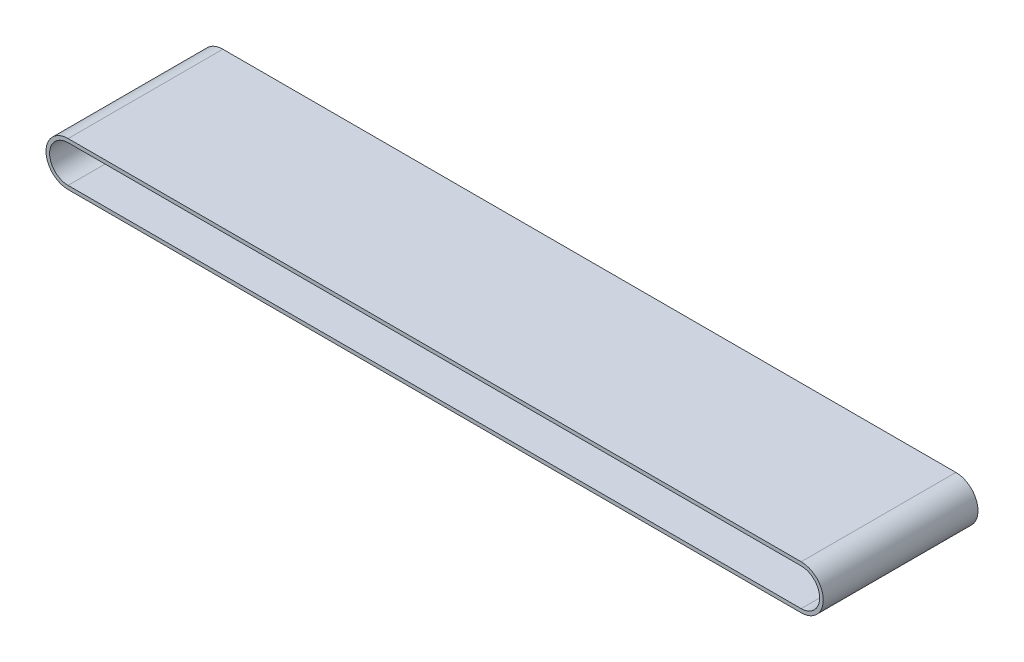
ISO-10303-21;
HEADER;
FILE_DESCRIPTION(('STEP AP214'),'2;1');
FILE_NAME('part.step','',(''),(''),'','','');
FILE_SCHEMA(('AUTOMOTIVE_DESIGN { 1 0 10303 214 1 1 1 1 }'));
ENDSEC;
DATA;
#1=APPLICATION_CONTEXT('core data for automotive mechanical design processes');
#2=APPLICATION_PROTOCOL_DEFINITION('international standard','automotive_design',2000,#1);
#3=PRODUCT_CONTEXT('',#1,'mechanical');
#4=PRODUCT('Part','Part','',(#3));
#5=PRODUCT_RELATED_PRODUCT_CATEGORY('part','',(#4));
#6=PRODUCT_DEFINITION_FORMATION('','',#4);
#7=PRODUCT_DEFINITION_CONTEXT('part definition',#1,'design');
#8=PRODUCT_DEFINITION('design','',#6,#7);
#9=PRODUCT_DEFINITION_SHAPE('','',#8);
#10=(LENGTH_UNIT() NAMED_UNIT(*) SI_UNIT(.MILLI.,.METRE.));
#11=(NAMED_UNIT(*) PLANE_ANGLE_UNIT() SI_UNIT($,.RADIAN.));
#12=(NAMED_UNIT(*) SI_UNIT($,.STERADIAN.) SOLID_ANGLE_UNIT());
#13=UNCERTAINTY_MEASURE_WITH_UNIT(LENGTH_MEASURE(1.E-05),#10,'distance_accuracy_value','');
#14=(GEOMETRIC_REPRESENTATION_CONTEXT(3) GLOBAL_UNCERTAINTY_ASSIGNED_CONTEXT((#13)) GLOBAL_UNIT_ASSIGNED_CONTEXT((#10,
#11,#12)) REPRESENTATION_CONTEXT('',''));
#15=CARTESIAN_POINT('',(0.,0.,0.));
#16=DIRECTION('',(0.,0.,1.));
#17=DIRECTION('',(1.,0.,0.));
#18=AXIS2_PLACEMENT_3D('',#15,#16,#17);
#19=CARTESIAN_POINT('',(-2517.43024211006,-127.5,1067.));
#20=DIRECTION('',(0.,0.,1.));
#21=DIRECTION('',(1.,0.,0.));
#22=AXIS2_PLACEMENT_3D('',#19,#20,#21);
#23=PLANE('',#22);
#24=CARTESIAN_POINT('',(-2517.43024211006,-127.5,1067.));
#25=DIRECTION('',(0.,0.,1.));
#26=DIRECTION('',(1.,0.,0.));
#27=AXIS2_PLACEMENT_3D('',#24,#25,#26);
#28=CIRCLE('',#27,152.5);
#29=CARTESIAN_POINT('',(-2517.43024211006,25.,1067.));
#30=VERTEX_POINT('',#29);
#31=CARTESIAN_POINT('',(-2517.43024211006,-280.,1067.));
#32=VERTEX_POINT('',#31);
#33=EDGE_CURVE('E155',#30,#32,#28,.T.);
#34=ORIENTED_EDGE('',*,*,#33,.T.);
#35=DIRECTION('',(1.,0.,0.));
#36=VECTOR('',#35,1.);
#37=CARTESIAN_POINT('',(-2517.43024211006,-280.,1067.));
#38=LINE('',#37,#36);
#39=CARTESIAN_POINT('',(2537.56975788994,-280.,1067.));
#40=VERTEX_POINT('',#39);
#41=EDGE_CURVE('E159',#32,#40,#38,.T.);
#42=ORIENTED_EDGE('',*,*,#41,.T.);
#43=CARTESIAN_POINT('',(2537.56975788994,-127.5,1067.));
#44=DIRECTION('',(0.,0.,1.));
#45=DIRECTION('',(-1.,0.,0.));
#46=AXIS2_PLACEMENT_3D('',#43,#44,#45);
#47=CIRCLE('',#46,152.5);
#48=CARTESIAN_POINT('',(2537.56975788994,25.,1067.));
#49=VERTEX_POINT('',#48);
#50=EDGE_CURVE('E163',#40,#49,#47,.T.);
#51=ORIENTED_EDGE('',*,*,#50,.T.);
#52=DIRECTION('',(-1.,0.,0.));
#53=VECTOR('',#52,1.);
#54=CARTESIAN_POINT('',(-2517.43024211006,25.,1067.));
#55=LINE('',#54,#53);
#56=EDGE_CURVE('E166',#49,#30,#55,.T.);
#57=ORIENTED_EDGE('',*,*,#56,.T.);
#58=EDGE_LOOP('',(#34,#42,#51,#57));
#59=FACE_BOUND('',#58,.T.);
#60=DIRECTION('',(1.,0.,0.));
#61=VECTOR('',#60,1.);
#62=CARTESIAN_POINT('',(-2517.43024211006,-255.,1067.));
#63=LINE('',#62,#61);
#64=CARTESIAN_POINT('',(-2517.43024211006,-255.,1067.));
#65=VERTEX_POINT('',#64);
#66=CARTESIAN_POINT('',(2537.56975788994,-255.,1067.));
#67=VERTEX_POINT('',#66);
#68=EDGE_CURVE('E116',#65,#67,#63,.T.);
#69=ORIENTED_EDGE('',*,*,#68,.F.);
#70=CARTESIAN_POINT('',(-2517.43024211006,-127.5,1067.));
#71=DIRECTION('',(0.,0.,1.));
#72=DIRECTION('',(1.,0.,0.));
#73=AXIS2_PLACEMENT_3D('',#70,#71,#72);
#74=CIRCLE('',#73,127.5);
#75=CARTESIAN_POINT('',(-2517.43024211006,0.,1067.));
#76=VERTEX_POINT('',#75);
#77=EDGE_CURVE('E107',#76,#65,#74,.T.);
#78=ORIENTED_EDGE('',*,*,#77,.F.);
#79=DIRECTION('',(-1.,0.,0.));
#80=VECTOR('',#79,1.);
#81=CARTESIAN_POINT('',(-2517.43024211006,0.,1067.));
#82=LINE('',#81,#80);
#83=CARTESIAN_POINT('',(2537.56975788994,0.,1067.));
#84=VERTEX_POINT('',#83);
#85=EDGE_CURVE('E133',#84,#76,#82,.T.);
#86=ORIENTED_EDGE('',*,*,#85,.F.);
#87=CARTESIAN_POINT('',(2537.56975788994,-127.5,1067.));
#88=DIRECTION('',(0.,0.,1.));
#89=DIRECTION('',(-1.,0.,0.));
#90=AXIS2_PLACEMENT_3D('',#87,#88,#89);
#91=CIRCLE('',#90,127.5);
#92=EDGE_CURVE('E129',#67,#84,#91,.T.);
#93=ORIENTED_EDGE('',*,*,#92,.F.);
#94=EDGE_LOOP('',(#69,#78,#86,#93));
#95=FACE_BOUND('',#94,.T.);
#96=ADVANCED_FACE('F41',(#59,#95),#23,.T.);
#97=CARTESIAN_POINT('',(-2517.43024211006,-127.5,0.));
#98=DIRECTION('',(0.,0.,1.));
#99=DIRECTION('',(1.,0.,0.));
#100=AXIS2_PLACEMENT_3D('',#97,#98,#99);
#101=PLANE('',#100);
#102=CARTESIAN_POINT('',(-2517.43024211006,-127.5,0.));
#103=DIRECTION('',(0.,0.,1.));
#104=DIRECTION('',(1.,0.,0.));
#105=AXIS2_PLACEMENT_3D('',#102,#103,#104);
#106=CIRCLE('',#105,152.5);
#107=CARTESIAN_POINT('',(-2517.43024211006,25.,0.));
#108=VERTEX_POINT('',#107);
#109=CARTESIAN_POINT('',(-2517.43024211006,-280.,0.));
#110=VERTEX_POINT('',#109);
#111=EDGE_CURVE('E125',#108,#110,#106,.T.);
#112=ORIENTED_EDGE('',*,*,#111,.F.);
#113=DIRECTION('',(-1.,0.,0.));
#114=VECTOR('',#113,1.);
#115=CARTESIAN_POINT('',(-2517.43024211006,25.,0.));
#116=LINE('',#115,#114);
#117=CARTESIAN_POINT('',(2537.56975788994,25.,0.));
#118=VERTEX_POINT('',#117);
#119=EDGE_CURVE('E160',#118,#108,#116,.T.);
#120=ORIENTED_EDGE('',*,*,#119,.F.);
#121=CARTESIAN_POINT('',(2537.56975788994,-127.5,0.));
#122=DIRECTION('',(0.,0.,1.));
#123=DIRECTION('',(-1.,0.,0.));
#124=AXIS2_PLACEMENT_3D('',#121,#122,#123);
#125=CIRCLE('',#124,152.5);
#126=CARTESIAN_POINT('',(2537.56975788994,-280.,0.));
#127=VERTEX_POINT('',#126);
#128=EDGE_CURVE('E176',#127,#118,#125,.T.);
#129=ORIENTED_EDGE('',*,*,#128,.F.);
#130=DIRECTION('',(1.,0.,0.));
#131=VECTOR('',#130,1.);
#132=CARTESIAN_POINT('',(-2517.43024211006,-280.,0.));
#133=LINE('',#132,#131);
#134=EDGE_CURVE('E173',#110,#127,#133,.T.);
#135=ORIENTED_EDGE('',*,*,#134,.F.);
#136=EDGE_LOOP('',(#112,#120,#129,#135));
#137=FACE_BOUND('',#136,.T.);
#138=CARTESIAN_POINT('',(-2517.43024211006,-127.5,0.));
#139=DIRECTION('',(0.,0.,1.));
#140=DIRECTION('',(1.,0.,0.));
#141=AXIS2_PLACEMENT_3D('',#138,#139,#140);
#142=CIRCLE('',#141,127.5);
#143=CARTESIAN_POINT('',(-2517.43024211006,0.,0.));
#144=VERTEX_POINT('',#143);
#145=CARTESIAN_POINT('',(-2517.43024211006,-255.,0.));
#146=VERTEX_POINT('',#145);
#147=EDGE_CURVE('E65',#144,#146,#142,.T.);
#148=ORIENTED_EDGE('',*,*,#147,.T.);
#149=DIRECTION('',(1.,0.,0.));
#150=VECTOR('',#149,1.);
#151=CARTESIAN_POINT('',(-2517.43024211006,-255.,0.));
#152=LINE('',#151,#150);
#153=CARTESIAN_POINT('',(2537.56975788994,-255.,0.));
#154=VERTEX_POINT('',#153);
#155=EDGE_CURVE('E123',#146,#154,#152,.T.);
#156=ORIENTED_EDGE('',*,*,#155,.T.);
#157=CARTESIAN_POINT('',(2537.56975788994,-127.5,0.));
#158=DIRECTION('',(0.,0.,1.));
#159=DIRECTION('',(-1.,0.,0.));
#160=AXIS2_PLACEMENT_3D('',#157,#158,#159);
#161=CIRCLE('',#160,127.5);
#162=CARTESIAN_POINT('',(2537.56975788994,0.,0.));
#163=VERTEX_POINT('',#162);
#164=EDGE_CURVE('E142',#154,#163,#161,.T.);
#165=ORIENTED_EDGE('',*,*,#164,.T.);
#166=DIRECTION('',(-1.,0.,0.));
#167=VECTOR('',#166,1.);
#168=CARTESIAN_POINT('',(-2517.43024211006,0.,0.));
#169=LINE('',#168,#167);
#170=EDGE_CURVE('E117',#163,#144,#169,.T.);
#171=ORIENTED_EDGE('',*,*,#170,.T.);
#172=EDGE_LOOP('',(#148,#156,#165,#171));
#173=FACE_BOUND('',#172,.T.);
#174=ADVANCED_FACE('F199',(#137,#173),#101,.F.);
#175=CARTESIAN_POINT('',(-2517.43024211006,-127.5,1067.));
#176=DIRECTION('',(0.,0.,-1.));
#177=DIRECTION('',(-1.,0.,0.));
#178=AXIS2_PLACEMENT_3D('',#175,#176,#177);
#179=CYLINDRICAL_SURFACE('',#178,152.5);
#180=ORIENTED_EDGE('',*,*,#111,.T.);
#181=DIRECTION('',(0.,0.,-1.));
#182=VECTOR('',#181,1.);
#183=CARTESIAN_POINT('',(-2517.43024211006,-280.,1067.));
#184=LINE('',#183,#182);
#185=EDGE_CURVE('E11',#32,#110,#184,.T.);
#186=ORIENTED_EDGE('',*,*,#185,.F.);
#187=ORIENTED_EDGE('',*,*,#33,.F.);
#188=DIRECTION('',(0.,0.,-1.));
#189=VECTOR('',#188,1.);
#190=CARTESIAN_POINT('',(-2517.43024211006,25.,1067.));
#191=LINE('',#190,#189);
#192=EDGE_CURVE('E169',#30,#108,#191,.T.);
#193=ORIENTED_EDGE('',*,*,#192,.T.);
#194=EDGE_LOOP('',(#180,#186,#187,#193));
#195=FACE_BOUND('',#194,.T.);
#196=ADVANCED_FACE('F43',(#195),#179,.T.);
#197=CARTESIAN_POINT('',(-2517.43024211006,-280.,1067.));
#198=DIRECTION('',(0.,1.,0.));
#199=DIRECTION('',(0.,0.,1.));
#200=AXIS2_PLACEMENT_3D('',#197,#198,#199);
#201=PLANE('',#200);
#202=ORIENTED_EDGE('',*,*,#134,.T.);
#203=DIRECTION('',(0.,0.,-1.));
#204=VECTOR('',#203,1.);
#205=CARTESIAN_POINT('',(2537.56975788994,-280.,1067.));
#206=LINE('',#205,#204);
#207=EDGE_CURVE('E50',#40,#127,#206,.T.);
#208=ORIENTED_EDGE('',*,*,#207,.F.);
#209=ORIENTED_EDGE('',*,*,#41,.F.);
#210=ORIENTED_EDGE('',*,*,#185,.T.);
#211=EDGE_LOOP('',(#202,#208,#209,#210));
#212=FACE_BOUND('',#211,.T.);
#213=ADVANCED_FACE('F209',(#212),#201,.F.);
#214=CARTESIAN_POINT('',(2537.56975788994,-127.5,1067.));
#215=DIRECTION('',(0.,0.,-1.));
#216=DIRECTION('',(-1.,0.,0.));
#217=AXIS2_PLACEMENT_3D('',#214,#215,#216);
#218=CYLINDRICAL_SURFACE('',#217,152.5);
#219=ORIENTED_EDGE('',*,*,#128,.T.);
#220=DIRECTION('',(0.,0.,-1.));
#221=VECTOR('',#220,1.);
#222=CARTESIAN_POINT('',(2537.56975788994,25.,1067.));
#223=LINE('',#222,#221);
#224=EDGE_CURVE('E184',#49,#118,#223,.T.);
#225=ORIENTED_EDGE('',*,*,#224,.F.);
#226=ORIENTED_EDGE('',*,*,#50,.F.);
#227=ORIENTED_EDGE('',*,*,#207,.T.);
#228=EDGE_LOOP('',(#219,#225,#226,#227));
#229=FACE_BOUND('',#228,.T.);
#230=ADVANCED_FACE('F193',(#229),#218,.T.);
#231=CARTESIAN_POINT('',(-2517.43024211006,25.,1067.));
#232=DIRECTION('',(0.,-1.,0.));
#233=DIRECTION('',(0.,0.,-1.));
#234=AXIS2_PLACEMENT_3D('',#231,#232,#233);
#235=PLANE('',#234);
#236=ORIENTED_EDGE('',*,*,#119,.T.);
#237=ORIENTED_EDGE('',*,*,#192,.F.);
#238=ORIENTED_EDGE('',*,*,#56,.F.);
#239=ORIENTED_EDGE('',*,*,#224,.T.);
#240=EDGE_LOOP('',(#236,#237,#238,#239));
#241=FACE_BOUND('',#240,.T.);
#242=ADVANCED_FACE('F203',(#241),#235,.F.);
#243=CARTESIAN_POINT('',(-2517.43024211006,-127.5,1067.));
#244=DIRECTION('',(0.,0.,-1.));
#245=DIRECTION('',(-1.,0.,0.));
#246=AXIS2_PLACEMENT_3D('',#243,#244,#245);
#247=CYLINDRICAL_SURFACE('',#246,127.5);
#248=ORIENTED_EDGE('',*,*,#147,.F.);
#249=DIRECTION('',(0.,0.,-1.));
#250=VECTOR('',#249,1.);
#251=CARTESIAN_POINT('',(-2517.43024211006,0.,1067.));
#252=LINE('',#251,#250);
#253=EDGE_CURVE('E111',#76,#144,#252,.T.);
#254=ORIENTED_EDGE('',*,*,#253,.F.);
#255=ORIENTED_EDGE('',*,*,#77,.T.);
#256=DIRECTION('',(0.,0.,-1.));
#257=VECTOR('',#256,1.);
#258=CARTESIAN_POINT('',(-2517.43024211006,-255.,1067.));
#259=LINE('',#258,#257);
#260=EDGE_CURVE('E110',#65,#146,#259,.T.);
#261=ORIENTED_EDGE('',*,*,#260,.T.);
#262=EDGE_LOOP('',(#248,#254,#255,#261));
#263=FACE_BOUND('',#262,.T.);
#264=ADVANCED_FACE('F109',(#263),#247,.F.);
#265=CARTESIAN_POINT('',(-2517.43024211006,-255.,1067.));
#266=DIRECTION('',(0.,1.,0.));
#267=DIRECTION('',(-1.,0.,0.));
#268=AXIS2_PLACEMENT_3D('',#265,#266,#267);
#269=PLANE('',#268);
#270=ORIENTED_EDGE('',*,*,#155,.F.);
#271=ORIENTED_EDGE('',*,*,#260,.F.);
#272=ORIENTED_EDGE('',*,*,#68,.T.);
#273=DIRECTION('',(0.,0.,-1.));
#274=VECTOR('',#273,1.);
#275=CARTESIAN_POINT('',(2537.56975788994,-255.,1067.));
#276=LINE('',#275,#274);
#277=EDGE_CURVE('E126',#67,#154,#276,.T.);
#278=ORIENTED_EDGE('',*,*,#277,.T.);
#279=EDGE_LOOP('',(#270,#271,#272,#278));
#280=FACE_BOUND('',#279,.T.);
#281=ADVANCED_FACE('F120',(#280),#269,.T.);
#282=CARTESIAN_POINT('',(2537.56975788994,-127.5,1067.));
#283=DIRECTION('',(0.,0.,-1.));
#284=DIRECTION('',(-1.,0.,0.));
#285=AXIS2_PLACEMENT_3D('',#282,#283,#284);
#286=CYLINDRICAL_SURFACE('',#285,127.5);
#287=ORIENTED_EDGE('',*,*,#164,.F.);
#288=ORIENTED_EDGE('',*,*,#277,.F.);
#289=ORIENTED_EDGE('',*,*,#92,.T.);
#290=DIRECTION('',(0.,0.,-1.));
#291=VECTOR('',#290,1.);
#292=CARTESIAN_POINT('',(2537.56975788994,0.,1067.));
#293=LINE('',#292,#291);
#294=EDGE_CURVE('E57',#84,#163,#293,.T.);
#295=ORIENTED_EDGE('',*,*,#294,.T.);
#296=EDGE_LOOP('',(#287,#288,#289,#295));
#297=FACE_BOUND('',#296,.T.);
#298=ADVANCED_FACE('F232',(#297),#286,.F.);
#299=CARTESIAN_POINT('',(-2517.43024211006,0.,1067.));
#300=DIRECTION('',(0.,-1.,0.));
#301=DIRECTION('',(0.,0.,-1.));
#302=AXIS2_PLACEMENT_3D('',#299,#300,#301);
#303=PLANE('',#302);
#304=ORIENTED_EDGE('',*,*,#170,.F.);
#305=ORIENTED_EDGE('',*,*,#294,.F.);
#306=ORIENTED_EDGE('',*,*,#85,.T.);
#307=ORIENTED_EDGE('',*,*,#253,.T.);
#308=EDGE_LOOP('',(#304,#305,#306,#307));
#309=FACE_BOUND('',#308,.T.);
#310=ADVANCED_FACE('F236',(#309),#303,.T.);
#311=CLOSED_SHELL('',(#96,#174,#196,#213,#230,#242,#264,#281,#298,#310));
#312=MANIFOLD_SOLID_BREP('B2',#311);
#313=ADVANCED_BREP_SHAPE_REPRESENTATION('',(#18,#312),#14);
#314=SHAPE_DEFINITION_REPRESENTATION(#9,#313);
ENDSEC;
END-ISO-10303-21;
